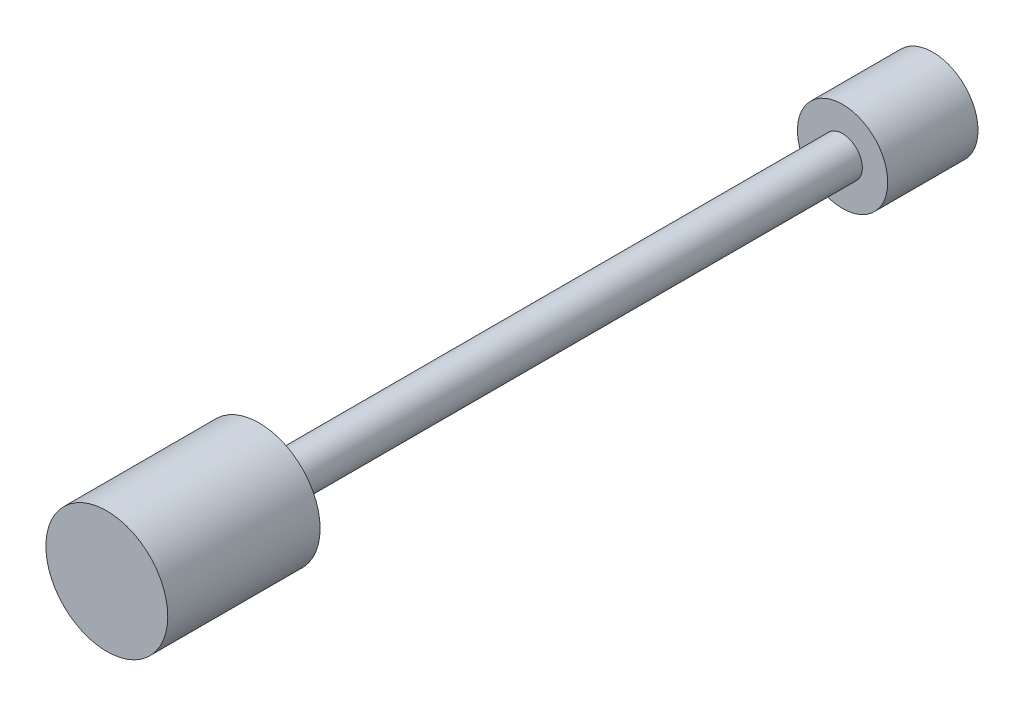
ISO-10303-21;
HEADER;
FILE_DESCRIPTION(('STEP AP214'),'2;1');
FILE_NAME('part.step','',(''),(''),'','','');
FILE_SCHEMA(('AUTOMOTIVE_DESIGN { 1 0 10303 214 1 1 1 1 }'));
ENDSEC;
DATA;
#1=APPLICATION_CONTEXT('core data for automotive mechanical design processes');
#2=APPLICATION_PROTOCOL_DEFINITION('international standard','automotive_design',2000,#1);
#3=PRODUCT_CONTEXT('',#1,'mechanical');
#4=PRODUCT('Part','Part','',(#3));
#5=PRODUCT_RELATED_PRODUCT_CATEGORY('part','',(#4));
#6=PRODUCT_DEFINITION_FORMATION('','',#4);
#7=PRODUCT_DEFINITION_CONTEXT('part definition',#1,'design');
#8=PRODUCT_DEFINITION('design','',#6,#7);
#9=PRODUCT_DEFINITION_SHAPE('','',#8);
#10=(LENGTH_UNIT() NAMED_UNIT(*) SI_UNIT(.MILLI.,.METRE.));
#11=(NAMED_UNIT(*) PLANE_ANGLE_UNIT() SI_UNIT($,.RADIAN.));
#12=(NAMED_UNIT(*) SI_UNIT($,.STERADIAN.) SOLID_ANGLE_UNIT());
#13=UNCERTAINTY_MEASURE_WITH_UNIT(LENGTH_MEASURE(1.E-05),#10,'distance_accuracy_value','');
#14=(GEOMETRIC_REPRESENTATION_CONTEXT(3) GLOBAL_UNCERTAINTY_ASSIGNED_CONTEXT((#13)) GLOBAL_UNIT_ASSIGNED_CONTEXT((#10,
#11,#12)) REPRESENTATION_CONTEXT('',''));
#15=CARTESIAN_POINT('',(0.,0.,0.));
#16=DIRECTION('',(0.,0.,1.));
#17=DIRECTION('',(1.,0.,0.));
#18=AXIS2_PLACEMENT_3D('',#15,#16,#17);
#19=CARTESIAN_POINT('',(0.,0.,8.));
#20=DIRECTION('',(0.,0.,-1.));
#21=DIRECTION('',(-1.,0.,0.));
#22=AXIS2_PLACEMENT_3D('',#19,#20,#21);
#23=CYLINDRICAL_SURFACE('',#22,4.);
#24=CARTESIAN_POINT('',(0.,0.,8.));
#25=DIRECTION('',(0.,0.,1.));
#26=DIRECTION('',(1.,0.,0.));
#27=AXIS2_PLACEMENT_3D('',#24,#25,#26);
#28=CIRCLE('',#27,4.);
#29=CARTESIAN_POINT('',(4.,0.,8.));
#30=VERTEX_POINT('',#29);
#31=EDGE_CURVE('E37',#30,#30,#28,.T.);
#32=ORIENTED_EDGE('',*,*,#31,.F.);
#33=EDGE_LOOP('',(#32));
#34=FACE_BOUND('',#33,.T.);
#35=CARTESIAN_POINT('',(0.,0.,0.));
#36=DIRECTION('',(0.,0.,1.));
#37=DIRECTION('',(1.,0.,0.));
#38=AXIS2_PLACEMENT_3D('',#35,#36,#37);
#39=CIRCLE('',#38,4.);
#40=CARTESIAN_POINT('',(4.,0.,0.));
#41=VERTEX_POINT('',#40);
#42=EDGE_CURVE('E33',#41,#41,#39,.T.);
#43=ORIENTED_EDGE('',*,*,#42,.T.);
#44=EDGE_LOOP('',(#43));
#45=FACE_BOUND('',#44,.T.);
#46=ADVANCED_FACE('F30',(#34,#45),#23,.T.);
#47=CARTESIAN_POINT('',(0.,0.,8.));
#48=DIRECTION('',(0.,0.,1.));
#49=DIRECTION('',(1.,0.,0.));
#50=AXIS2_PLACEMENT_3D('',#47,#48,#49);
#51=PLANE('',#50);
#52=CARTESIAN_POINT('',(0.,0.,8.));
#53=DIRECTION('',(0.,0.,1.));
#54=DIRECTION('',(1.,0.,0.));
#55=AXIS2_PLACEMENT_3D('',#52,#53,#54);
#56=CIRCLE('',#55,1.75);
#57=CARTESIAN_POINT('',(1.75,0.,8.));
#58=VERTEX_POINT('',#57);
#59=EDGE_CURVE('E10',#58,#58,#56,.T.);
#60=ORIENTED_EDGE('',*,*,#59,.F.);
#61=EDGE_LOOP('',(#60));
#62=FACE_BOUND('',#61,.T.);
#63=ORIENTED_EDGE('',*,*,#31,.T.);
#64=EDGE_LOOP('',(#63));
#65=FACE_BOUND('',#64,.T.);
#66=ADVANCED_FACE('F71',(#62,#65),#51,.T.);
#67=CARTESIAN_POINT('',(0.,0.,0.));
#68=DIRECTION('',(0.,0.,1.));
#69=DIRECTION('',(1.,0.,0.));
#70=AXIS2_PLACEMENT_3D('',#67,#68,#69);
#71=PLANE('',#70);
#72=ORIENTED_EDGE('',*,*,#42,.F.);
#73=EDGE_LOOP('',(#72));
#74=FACE_BOUND('',#73,.T.);
#75=ADVANCED_FACE('F76',(#74),#71,.F.);
#76=CARTESIAN_POINT('',(0.,0.,59.7));
#77=DIRECTION('',(0.,0.,-1.));
#78=DIRECTION('',(-1.,0.,0.));
#79=AXIS2_PLACEMENT_3D('',#76,#77,#78);
#80=CYLINDRICAL_SURFACE('',#79,1.75);
#81=CARTESIAN_POINT('',(0.,0.,59.7));
#82=DIRECTION('',(0.,0.,1.));
#83=DIRECTION('',(1.,0.,0.));
#84=AXIS2_PLACEMENT_3D('',#81,#82,#83);
#85=CIRCLE('',#84,1.75);
#86=CARTESIAN_POINT('',(1.75,0.,59.7));
#87=VERTEX_POINT('',#86);
#88=EDGE_CURVE('E43',#87,#87,#85,.T.);
#89=ORIENTED_EDGE('',*,*,#88,.F.);
#90=EDGE_LOOP('',(#89));
#91=FACE_BOUND('',#90,.T.);
#92=ORIENTED_EDGE('',*,*,#59,.T.);
#93=EDGE_LOOP('',(#92));
#94=FACE_BOUND('',#93,.T.);
#95=ADVANCED_FACE('F58',(#91,#94),#80,.T.);
#96=CARTESIAN_POINT('',(0.,0.,73.2));
#97=DIRECTION('',(0.,0.,-1.));
#98=DIRECTION('',(-1.,0.,0.));
#99=AXIS2_PLACEMENT_3D('',#96,#97,#98);
#100=CYLINDRICAL_SURFACE('',#99,5.4);
#101=CARTESIAN_POINT('',(0.,0.,73.2));
#102=DIRECTION('',(0.,0.,1.));
#103=DIRECTION('',(1.,0.,0.));
#104=AXIS2_PLACEMENT_3D('',#101,#102,#103);
#105=CIRCLE('',#104,5.4);
#106=CARTESIAN_POINT('',(5.4,0.,73.2));
#107=VERTEX_POINT('',#106);
#108=EDGE_CURVE('E46',#107,#107,#105,.T.);
#109=ORIENTED_EDGE('',*,*,#108,.F.);
#110=EDGE_LOOP('',(#109));
#111=FACE_BOUND('',#110,.T.);
#112=CARTESIAN_POINT('',(0.,0.,59.7));
#113=DIRECTION('',(0.,0.,1.));
#114=DIRECTION('',(1.,0.,0.));
#115=AXIS2_PLACEMENT_3D('',#112,#113,#114);
#116=CIRCLE('',#115,5.4);
#117=CARTESIAN_POINT('',(5.4,0.,59.7));
#118=VERTEX_POINT('',#117);
#119=EDGE_CURVE('E47',#118,#118,#116,.T.);
#120=ORIENTED_EDGE('',*,*,#119,.T.);
#121=EDGE_LOOP('',(#120));
#122=FACE_BOUND('',#121,.T.);
#123=ADVANCED_FACE('F55',(#111,#122),#100,.T.);
#124=CARTESIAN_POINT('',(0.,0.,73.2));
#125=DIRECTION('',(0.,0.,1.));
#126=DIRECTION('',(1.,0.,0.));
#127=AXIS2_PLACEMENT_3D('',#124,#125,#126);
#128=PLANE('',#127);
#129=ORIENTED_EDGE('',*,*,#108,.T.);
#130=EDGE_LOOP('',(#129));
#131=FACE_BOUND('',#130,.T.);
#132=ADVANCED_FACE('F53',(#131),#128,.T.);
#133=CARTESIAN_POINT('',(0.,0.,59.7));
#134=DIRECTION('',(0.,0.,1.));
#135=DIRECTION('',(1.,0.,0.));
#136=AXIS2_PLACEMENT_3D('',#133,#134,#135);
#137=PLANE('',#136);
#138=ORIENTED_EDGE('',*,*,#88,.T.);
#139=EDGE_LOOP('',(#138));
#140=FACE_BOUND('',#139,.T.);
#141=ORIENTED_EDGE('',*,*,#119,.F.);
#142=EDGE_LOOP('',(#141));
#143=FACE_BOUND('',#142,.T.);
#144=ADVANCED_FACE('F62',(#140,#143),#137,.F.);
#145=CLOSED_SHELL('',(#46,#66,#75,#95,#123,#132,#144));
#146=MANIFOLD_SOLID_BREP('B2',#145);
#147=ADVANCED_BREP_SHAPE_REPRESENTATION('',(#18,#146),#14);
#148=SHAPE_DEFINITION_REPRESENTATION(#9,#147);
ENDSEC;
END-ISO-10303-21;
